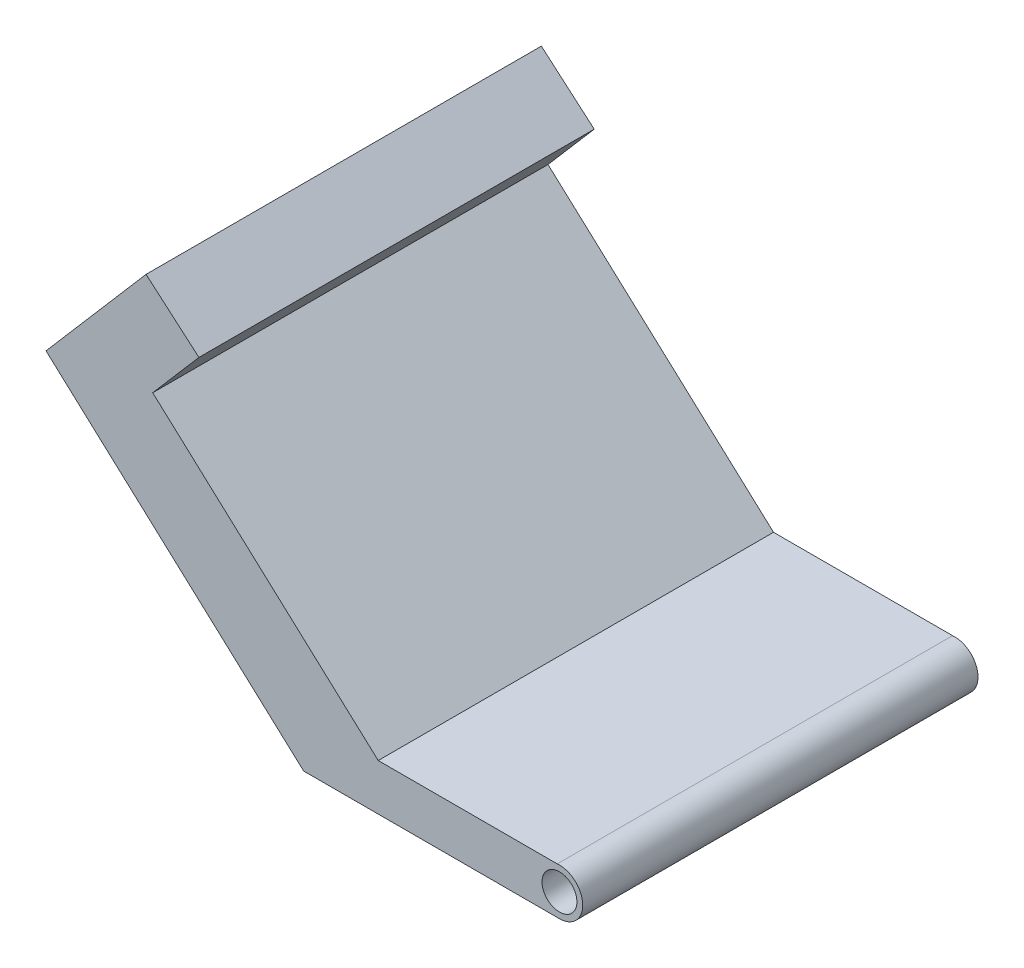
ISO-10303-21;
HEADER;
FILE_DESCRIPTION(('STEP AP214'),'2;1');
FILE_NAME('part.step','',(''),(''),'','','');
FILE_SCHEMA(('AUTOMOTIVE_DESIGN { 1 0 10303 214 1 1 1 1 }'));
ENDSEC;
DATA;
#1=APPLICATION_CONTEXT('core data for automotive mechanical design processes');
#2=APPLICATION_PROTOCOL_DEFINITION('international standard','automotive_design',2000,#1);
#3=PRODUCT_CONTEXT('',#1,'mechanical');
#4=PRODUCT('Part','Part','',(#3));
#5=PRODUCT_RELATED_PRODUCT_CATEGORY('part','',(#4));
#6=PRODUCT_DEFINITION_FORMATION('','',#4);
#7=PRODUCT_DEFINITION_CONTEXT('part definition',#1,'design');
#8=PRODUCT_DEFINITION('design','',#6,#7);
#9=PRODUCT_DEFINITION_SHAPE('','',#8);
#10=(LENGTH_UNIT() NAMED_UNIT(*) SI_UNIT(.MILLI.,.METRE.));
#11=(NAMED_UNIT(*) PLANE_ANGLE_UNIT() SI_UNIT($,.RADIAN.));
#12=(NAMED_UNIT(*) SI_UNIT($,.STERADIAN.) SOLID_ANGLE_UNIT());
#13=UNCERTAINTY_MEASURE_WITH_UNIT(LENGTH_MEASURE(1.E-05),#10,'distance_accuracy_value','');
#14=(GEOMETRIC_REPRESENTATION_CONTEXT(3) GLOBAL_UNCERTAINTY_ASSIGNED_CONTEXT((#13)) GLOBAL_UNIT_ASSIGNED_CONTEXT((#10,
#11,#12)) REPRESENTATION_CONTEXT('',''));
#15=CARTESIAN_POINT('',(0.,0.,0.));
#16=DIRECTION('',(0.,0.,1.));
#17=DIRECTION('',(1.,0.,0.));
#18=AXIS2_PLACEMENT_3D('',#15,#16,#17);
#19=CARTESIAN_POINT('',(0.,0.,170.));
#20=DIRECTION('',(0.,0.,1.));
#21=DIRECTION('',(1.,0.,0.));
#22=AXIS2_PLACEMENT_3D('',#19,#20,#21);
#23=PLANE('',#22);
#24=DIRECTION('',(0.738734779072939,-0.673996236034042,0.));
#25=VECTOR('',#24,1.);
#26=CARTESIAN_POINT('',(-110.,-10.,170.));
#27=LINE('',#26,#25);
#28=CARTESIAN_POINT('',(-220.810216860941,91.0994354051062,170.));
#29=VERTEX_POINT('',#28);
#30=CARTESIAN_POINT('',(-110.,-10.,170.));
#31=VERTEX_POINT('',#30);
#32=EDGE_CURVE('E149',#29,#31,#27,.T.);
#33=ORIENTED_EDGE('',*,*,#32,.T.);
#34=DIRECTION('',(1.,0.,0.));
#35=VECTOR('',#34,1.);
#36=CARTESIAN_POINT('',(0.,-10.,170.));
#37=LINE('',#36,#35);
#38=CARTESIAN_POINT('',(0.,-10.,170.));
#39=VERTEX_POINT('',#38);
#40=EDGE_CURVE('E97',#31,#39,#37,.T.);
#41=ORIENTED_EDGE('',*,*,#40,.T.);
#42=CARTESIAN_POINT('',(0.,0.,170.));
#43=DIRECTION('',(0.,0.,1.));
#44=DIRECTION('',(1.,0.,0.));
#45=AXIS2_PLACEMENT_3D('',#42,#43,#44);
#46=CIRCLE('',#45,10.);
#47=CARTESIAN_POINT('',(-0.9565967237471,9.9541409829335,170.));
#48=VERTEX_POINT('',#47);
#49=EDGE_CURVE('E164',#39,#48,#46,.T.);
#50=ORIENTED_EDGE('',*,*,#49,.T.);
#51=DIRECTION('',(-1.,0.,0.));
#52=VECTOR('',#51,1.);
#53=CARTESIAN_POINT('',(-0.956596723747104,9.9541409829335,170.));
#54=LINE('',#53,#52);
#55=CARTESIAN_POINT('',(-77.9427200083932,9.95414098293349,170.));
#56=VERTEX_POINT('',#55);
#57=EDGE_CURVE('E177',#48,#56,#54,.T.);
#58=ORIENTED_EDGE('',*,*,#57,.T.);
#59=DIRECTION('',(-0.738734779072939,0.673996236034042,0.));
#60=VECTOR('',#59,1.);
#61=CARTESIAN_POINT('',(-77.9427200083932,9.95414098293349,170.));
#62=LINE('',#61,#60);
#63=CARTESIAN_POINT('',(-174.921114521391,98.4338968168346,170.));
#64=VERTEX_POINT('',#63);
#65=EDGE_CURVE('E116',#56,#64,#62,.T.);
#66=ORIENTED_EDGE('',*,*,#65,.T.);
#67=DIRECTION('',(0.652254631296582,0.757999931366857,0.));
#68=VECTOR('',#67,1.);
#69=CARTESIAN_POINT('',(-155.045503197309,121.531796466209,170.));
#70=LINE('',#69,#68);
#71=CARTESIAN_POINT('',(-155.045503197309,121.531796466209,170.));
#72=VERTEX_POINT('',#71);
#73=EDGE_CURVE('E110',#64,#72,#70,.T.);
#74=ORIENTED_EDGE('',*,*,#73,.T.);
#75=DIRECTION('',(-0.757999931366858,0.652254631296581,0.));
#76=VECTOR('',#75,1.);
#77=CARTESIAN_POINT('',(-177.785501138315,141.099435405106,170.));
#78=LINE('',#77,#76);
#79=CARTESIAN_POINT('',(-177.785501138315,141.099435405106,170.));
#80=VERTEX_POINT('',#79);
#81=EDGE_CURVE('E114',#72,#80,#78,.T.);
#82=ORIENTED_EDGE('',*,*,#81,.T.);
#83=DIRECTION('',(-0.652254631296582,-0.757999931366857,0.));
#84=VECTOR('',#83,1.);
#85=CARTESIAN_POINT('',(-220.810216860941,91.0994354051062,170.));
#86=LINE('',#85,#84);
#87=EDGE_CURVE('E54',#80,#29,#86,.T.);
#88=ORIENTED_EDGE('',*,*,#87,.T.);
#89=EDGE_LOOP('',(#33,#41,#50,#58,#66,#74,#82,#88));
#90=FACE_BOUND('',#89,.T.);
#91=CARTESIAN_POINT('',(0.,0.,170.));
#92=DIRECTION('',(0.,0.,1.));
#93=DIRECTION('',(1.,0.,0.));
#94=AXIS2_PLACEMENT_3D('',#91,#92,#93);
#95=CIRCLE('',#94,7.5);
#96=CARTESIAN_POINT('',(7.5,0.,170.));
#97=VERTEX_POINT('',#96);
#98=EDGE_CURVE('E138',#97,#97,#95,.T.);
#99=ORIENTED_EDGE('',*,*,#98,.F.);
#100=EDGE_LOOP('',(#99));
#101=FACE_BOUND('',#100,.T.);
#102=ADVANCED_FACE('F37',(#90,#101),#23,.T.);
#103=CARTESIAN_POINT('',(0.,0.,0.));
#104=DIRECTION('',(0.,0.,1.));
#105=DIRECTION('',(1.,0.,0.));
#106=AXIS2_PLACEMENT_3D('',#103,#104,#105);
#107=PLANE('',#106);
#108=DIRECTION('',(0.738734779072939,-0.673996236034042,0.));
#109=VECTOR('',#108,1.);
#110=CARTESIAN_POINT('',(-110.,-10.,0.));
#111=LINE('',#110,#109);
#112=CARTESIAN_POINT('',(-220.810216860941,91.0994354051062,0.));
#113=VERTEX_POINT('',#112);
#114=CARTESIAN_POINT('',(-110.,-10.,0.));
#115=VERTEX_POINT('',#114);
#116=EDGE_CURVE('E134',#113,#115,#111,.T.);
#117=ORIENTED_EDGE('',*,*,#116,.F.);
#118=DIRECTION('',(-0.652254631296582,-0.757999931366857,0.));
#119=VECTOR('',#118,1.);
#120=CARTESIAN_POINT('',(-220.810216860941,91.0994354051062,0.));
#121=LINE('',#120,#119);
#122=CARTESIAN_POINT('',(-177.785501138315,141.099435405106,0.));
#123=VERTEX_POINT('',#122);
#124=EDGE_CURVE('E89',#123,#113,#121,.T.);
#125=ORIENTED_EDGE('',*,*,#124,.F.);
#126=DIRECTION('',(-0.757999931366858,0.652254631296581,0.));
#127=VECTOR('',#126,1.);
#128=CARTESIAN_POINT('',(-177.785501138315,141.099435405106,0.));
#129=LINE('',#128,#127);
#130=CARTESIAN_POINT('',(-155.045503197309,121.531796466209,0.));
#131=VERTEX_POINT('',#130);
#132=EDGE_CURVE('E83',#131,#123,#129,.T.);
#133=ORIENTED_EDGE('',*,*,#132,.F.);
#134=DIRECTION('',(0.652254631296582,0.757999931366857,0.));
#135=VECTOR('',#134,1.);
#136=CARTESIAN_POINT('',(-155.045503197309,121.531796466209,0.));
#137=LINE('',#136,#135);
#138=CARTESIAN_POINT('',(-174.921114521391,98.4338968168346,0.));
#139=VERTEX_POINT('',#138);
#140=EDGE_CURVE('E124',#139,#131,#137,.T.);
#141=ORIENTED_EDGE('',*,*,#140,.F.);
#142=DIRECTION('',(-0.738734779072939,0.673996236034042,0.));
#143=VECTOR('',#142,1.);
#144=CARTESIAN_POINT('',(-77.9427200083932,9.95414098293349,0.));
#145=LINE('',#144,#143);
#146=CARTESIAN_POINT('',(-77.9427200083932,9.95414098293349,0.));
#147=VERTEX_POINT('',#146);
#148=EDGE_CURVE('E144',#147,#139,#145,.T.);
#149=ORIENTED_EDGE('',*,*,#148,.F.);
#150=DIRECTION('',(-1.,0.,0.));
#151=VECTOR('',#150,1.);
#152=CARTESIAN_POINT('',(-0.956596723747104,9.9541409829335,0.));
#153=LINE('',#152,#151);
#154=CARTESIAN_POINT('',(-0.9565967237471,9.9541409829335,0.));
#155=VERTEX_POINT('',#154);
#156=EDGE_CURVE('E142',#155,#147,#153,.T.);
#157=ORIENTED_EDGE('',*,*,#156,.F.);
#158=CARTESIAN_POINT('',(0.,0.,0.));
#159=DIRECTION('',(0.,0.,1.));
#160=DIRECTION('',(1.,0.,0.));
#161=AXIS2_PLACEMENT_3D('',#158,#159,#160);
#162=CIRCLE('',#161,10.);
#163=CARTESIAN_POINT('',(0.,-10.,0.));
#164=VERTEX_POINT('',#163);
#165=EDGE_CURVE('E140',#164,#155,#162,.T.);
#166=ORIENTED_EDGE('',*,*,#165,.F.);
#167=DIRECTION('',(1.,0.,0.));
#168=VECTOR('',#167,1.);
#169=CARTESIAN_POINT('',(0.,-10.,0.));
#170=LINE('',#169,#168);
#171=EDGE_CURVE('E137',#115,#164,#170,.T.);
#172=ORIENTED_EDGE('',*,*,#171,.F.);
#173=EDGE_LOOP('',(#117,#125,#133,#141,#149,#157,#166,#172));
#174=FACE_BOUND('',#173,.T.);
#175=CARTESIAN_POINT('',(0.,0.,0.));
#176=DIRECTION('',(0.,0.,1.));
#177=DIRECTION('',(1.,0.,0.));
#178=AXIS2_PLACEMENT_3D('',#175,#176,#177);
#179=CIRCLE('',#178,7.5);
#180=CARTESIAN_POINT('',(7.5,0.,0.));
#181=VERTEX_POINT('',#180);
#182=EDGE_CURVE('E183',#181,#181,#179,.T.);
#183=ORIENTED_EDGE('',*,*,#182,.T.);
#184=EDGE_LOOP('',(#183));
#185=FACE_BOUND('',#184,.T.);
#186=ADVANCED_FACE('F168',(#174,#185),#107,.F.);
#187=CARTESIAN_POINT('',(-110.,-10.,170.));
#188=DIRECTION('',(0.673996236034042,0.738734779072939,0.));
#189=DIRECTION('',(-0.738734779072939,0.673996236034042,0.));
#190=AXIS2_PLACEMENT_3D('',#187,#188,#189);
#191=PLANE('',#190);
#192=ORIENTED_EDGE('',*,*,#116,.T.);
#193=DIRECTION('',(0.,0.,-1.));
#194=VECTOR('',#193,1.);
#195=CARTESIAN_POINT('',(-110.,-10.,170.));
#196=LINE('',#195,#194);
#197=EDGE_CURVE('E11',#31,#115,#196,.T.);
#198=ORIENTED_EDGE('',*,*,#197,.F.);
#199=ORIENTED_EDGE('',*,*,#32,.F.);
#200=DIRECTION('',(0.,0.,-1.));
#201=VECTOR('',#200,1.);
#202=CARTESIAN_POINT('',(-220.810216860941,91.0994354051062,170.));
#203=LINE('',#202,#201);
#204=EDGE_CURVE('E130',#29,#113,#203,.T.);
#205=ORIENTED_EDGE('',*,*,#204,.T.);
#206=EDGE_LOOP('',(#192,#198,#199,#205));
#207=FACE_BOUND('',#206,.T.);
#208=ADVANCED_FACE('F39',(#207),#191,.F.);
#209=CARTESIAN_POINT('',(0.,-10.,170.));
#210=DIRECTION('',(0.,1.,0.));
#211=DIRECTION('',(-1.,0.,0.));
#212=AXIS2_PLACEMENT_3D('',#209,#210,#211);
#213=PLANE('',#212);
#214=ORIENTED_EDGE('',*,*,#171,.T.);
#215=DIRECTION('',(0.,0.,-1.));
#216=VECTOR('',#215,1.);
#217=CARTESIAN_POINT('',(0.,-10.,170.));
#218=LINE('',#217,#216);
#219=EDGE_CURVE('E46',#39,#164,#218,.T.);
#220=ORIENTED_EDGE('',*,*,#219,.F.);
#221=ORIENTED_EDGE('',*,*,#40,.F.);
#222=ORIENTED_EDGE('',*,*,#197,.T.);
#223=EDGE_LOOP('',(#214,#220,#221,#222));
#224=FACE_BOUND('',#223,.T.);
#225=ADVANCED_FACE('F211',(#224),#213,.F.);
#226=CARTESIAN_POINT('',(0.,0.,170.));
#227=DIRECTION('',(0.,0.,-1.));
#228=DIRECTION('',(-1.,0.,0.));
#229=AXIS2_PLACEMENT_3D('',#226,#227,#228);
#230=CYLINDRICAL_SURFACE('',#229,10.);
#231=ORIENTED_EDGE('',*,*,#165,.T.);
#232=DIRECTION('',(0.,0.,-1.));
#233=VECTOR('',#232,1.);
#234=CARTESIAN_POINT('',(-0.9565967237471,9.9541409829335,170.));
#235=LINE('',#234,#233);
#236=EDGE_CURVE('E156',#48,#155,#235,.T.);
#237=ORIENTED_EDGE('',*,*,#236,.F.);
#238=ORIENTED_EDGE('',*,*,#49,.F.);
#239=ORIENTED_EDGE('',*,*,#219,.T.);
#240=EDGE_LOOP('',(#231,#237,#238,#239));
#241=FACE_BOUND('',#240,.T.);
#242=ADVANCED_FACE('F162',(#241),#230,.T.);
#243=CARTESIAN_POINT('',(-0.956596723747104,9.9541409829335,170.));
#244=DIRECTION('',(0.,-1.,0.));
#245=DIRECTION('',(1.,0.,0.));
#246=AXIS2_PLACEMENT_3D('',#243,#244,#245);
#247=PLANE('',#246);
#248=ORIENTED_EDGE('',*,*,#156,.T.);
#249=DIRECTION('',(0.,0.,-1.));
#250=VECTOR('',#249,1.);
#251=CARTESIAN_POINT('',(-77.9427200083932,9.95414098293349,170.));
#252=LINE('',#251,#250);
#253=EDGE_CURVE('E153',#56,#147,#252,.T.);
#254=ORIENTED_EDGE('',*,*,#253,.F.);
#255=ORIENTED_EDGE('',*,*,#57,.F.);
#256=ORIENTED_EDGE('',*,*,#236,.T.);
#257=EDGE_LOOP('',(#248,#254,#255,#256));
#258=FACE_BOUND('',#257,.T.);
#259=ADVANCED_FACE('F173',(#258),#247,.F.);
#260=CARTESIAN_POINT('',(-77.9427200083932,9.95414098293349,170.));
#261=DIRECTION('',(-0.673996236034042,-0.738734779072939,0.));
#262=DIRECTION('',(0.738734779072939,-0.673996236034042,0.));
#263=AXIS2_PLACEMENT_3D('',#260,#261,#262);
#264=PLANE('',#263);
#265=ORIENTED_EDGE('',*,*,#148,.T.);
#266=DIRECTION('',(0.,0.,-1.));
#267=VECTOR('',#266,1.);
#268=CARTESIAN_POINT('',(-174.921114521391,98.4338968168346,170.));
#269=LINE('',#268,#267);
#270=EDGE_CURVE('E125',#64,#139,#269,.T.);
#271=ORIENTED_EDGE('',*,*,#270,.F.);
#272=ORIENTED_EDGE('',*,*,#65,.F.);
#273=ORIENTED_EDGE('',*,*,#253,.T.);
#274=EDGE_LOOP('',(#265,#271,#272,#273));
#275=FACE_BOUND('',#274,.T.);
#276=ADVANCED_FACE('F176',(#275),#264,.F.);
#277=CARTESIAN_POINT('',(-155.045503197309,121.531796466209,170.));
#278=DIRECTION('',(-0.757999931366857,0.652254631296582,0.));
#279=DIRECTION('',(-0.652254631296582,-0.757999931366857,0.));
#280=AXIS2_PLACEMENT_3D('',#277,#278,#279);
#281=PLANE('',#280);
#282=ORIENTED_EDGE('',*,*,#140,.T.);
#283=DIRECTION('',(0.,0.,-1.));
#284=VECTOR('',#283,1.);
#285=CARTESIAN_POINT('',(-155.045503197309,121.531796466209,170.));
#286=LINE('',#285,#284);
#287=EDGE_CURVE('E121',#72,#131,#286,.T.);
#288=ORIENTED_EDGE('',*,*,#287,.F.);
#289=ORIENTED_EDGE('',*,*,#73,.F.);
#290=ORIENTED_EDGE('',*,*,#270,.T.);
#291=EDGE_LOOP('',(#282,#288,#289,#290));
#292=FACE_BOUND('',#291,.T.);
#293=ADVANCED_FACE('F122',(#292),#281,.F.);
#294=CARTESIAN_POINT('',(-177.785501138315,141.099435405106,170.));
#295=DIRECTION('',(-0.652254631296581,-0.757999931366858,0.));
#296=DIRECTION('',(0.757999931366858,-0.652254631296581,0.));
#297=AXIS2_PLACEMENT_3D('',#294,#295,#296);
#298=PLANE('',#297);
#299=ORIENTED_EDGE('',*,*,#132,.T.);
#300=DIRECTION('',(0.,0.,-1.));
#301=VECTOR('',#300,1.);
#302=CARTESIAN_POINT('',(-177.785501138315,141.099435405106,170.));
#303=LINE('',#302,#301);
#304=EDGE_CURVE('E126',#80,#123,#303,.T.);
#305=ORIENTED_EDGE('',*,*,#304,.F.);
#306=ORIENTED_EDGE('',*,*,#81,.F.);
#307=ORIENTED_EDGE('',*,*,#287,.T.);
#308=EDGE_LOOP('',(#299,#305,#306,#307));
#309=FACE_BOUND('',#308,.T.);
#310=ADVANCED_FACE('F128',(#309),#298,.F.);
#311=CARTESIAN_POINT('',(-220.810216860941,91.0994354051062,170.));
#312=DIRECTION('',(0.757999931366857,-0.652254631296582,0.));
#313=DIRECTION('',(0.652254631296582,0.757999931366857,0.));
#314=AXIS2_PLACEMENT_3D('',#311,#312,#313);
#315=PLANE('',#314);
#316=ORIENTED_EDGE('',*,*,#124,.T.);
#317=ORIENTED_EDGE('',*,*,#204,.F.);
#318=ORIENTED_EDGE('',*,*,#87,.F.);
#319=ORIENTED_EDGE('',*,*,#304,.T.);
#320=EDGE_LOOP('',(#316,#317,#318,#319));
#321=FACE_BOUND('',#320,.T.);
#322=ADVANCED_FACE('F199',(#321),#315,.F.);
#323=CARTESIAN_POINT('',(0.,0.,170.));
#324=DIRECTION('',(0.,0.,-1.));
#325=DIRECTION('',(-1.,0.,0.));
#326=AXIS2_PLACEMENT_3D('',#323,#324,#325);
#327=CYLINDRICAL_SURFACE('',#326,7.5);
#328=ORIENTED_EDGE('',*,*,#98,.T.);
#329=EDGE_LOOP('',(#328));
#330=FACE_BOUND('',#329,.T.);
#331=ORIENTED_EDGE('',*,*,#182,.F.);
#332=EDGE_LOOP('',(#331));
#333=FACE_BOUND('',#332,.T.);
#334=ADVANCED_FACE('F189',(#330,#333),#327,.F.);
#335=CLOSED_SHELL('',(#102,#186,#208,#225,#242,#259,#276,#293,#310,#322,#334));
#336=MANIFOLD_SOLID_BREP('B2',#335);
#337=ADVANCED_BREP_SHAPE_REPRESENTATION('',(#18,#336),#14);
#338=SHAPE_DEFINITION_REPRESENTATION(#9,#337);
ENDSEC;
END-ISO-10303-21;
